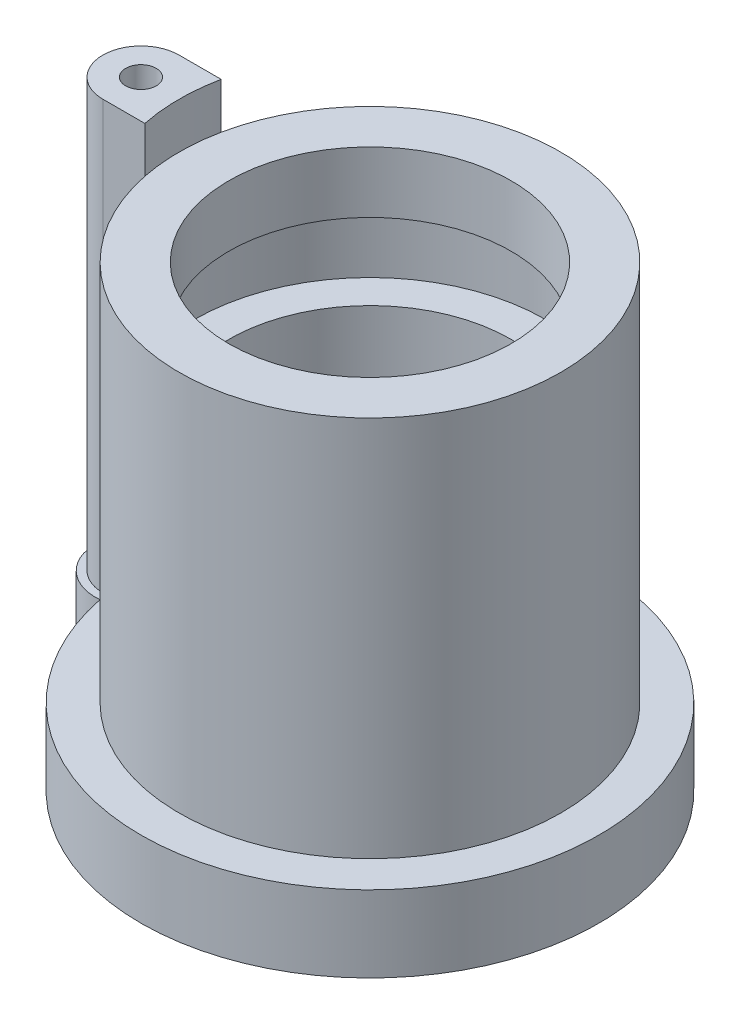
ISO-10303-21;
HEADER;
FILE_DESCRIPTION(('STEP AP214'),'2;1');
FILE_NAME('part.step','',(''),(''),'','','');
FILE_SCHEMA(('AUTOMOTIVE_DESIGN { 1 0 10303 214 1 1 1 1 }'));
ENDSEC;
DATA;
#1=APPLICATION_CONTEXT('core data for automotive mechanical design processes');
#2=APPLICATION_PROTOCOL_DEFINITION('international standard','automotive_design',2000,#1);
#3=PRODUCT_CONTEXT('',#1,'mechanical');
#4=PRODUCT('Part','Part','',(#3));
#5=PRODUCT_RELATED_PRODUCT_CATEGORY('part','',(#4));
#6=PRODUCT_DEFINITION_FORMATION('','',#4);
#7=PRODUCT_DEFINITION_CONTEXT('part definition',#1,'design');
#8=PRODUCT_DEFINITION('design','',#6,#7);
#9=PRODUCT_DEFINITION_SHAPE('','',#8);
#10=(LENGTH_UNIT() NAMED_UNIT(*) SI_UNIT(.MILLI.,.METRE.));
#11=(NAMED_UNIT(*) PLANE_ANGLE_UNIT() SI_UNIT($,.RADIAN.));
#12=(NAMED_UNIT(*) SI_UNIT($,.STERADIAN.) SOLID_ANGLE_UNIT());
#13=UNCERTAINTY_MEASURE_WITH_UNIT(LENGTH_MEASURE(1.E-05),#10,'distance_accuracy_value','');
#14=(GEOMETRIC_REPRESENTATION_CONTEXT(3) GLOBAL_UNCERTAINTY_ASSIGNED_CONTEXT((#13)) GLOBAL_UNIT_ASSIGNED_CONTEXT((#10,
#11,#12)) REPRESENTATION_CONTEXT('',''));
#15=CARTESIAN_POINT('',(0.,0.,0.));
#16=DIRECTION('',(0.,0.,1.));
#17=DIRECTION('',(1.,0.,0.));
#18=AXIS2_PLACEMENT_3D('',#15,#16,#17);
#19=CARTESIAN_POINT('',(0.,0.,0.));
#20=DIRECTION('',(0.,-1.,0.));
#21=DIRECTION('',(0.,0.,-1.));
#22=AXIS2_PLACEMENT_3D('',#19,#20,#21);
#23=PLANE('',#22);
#24=CARTESIAN_POINT('',(-15.,0.,0.));
#25=DIRECTION('',(0.,-1.,0.));
#26=DIRECTION('',(0.,0.,-1.));
#27=AXIS2_PLACEMENT_3D('',#24,#25,#26);
#28=CIRCLE('',#27,3.);
#29=CARTESIAN_POINT('',(-14.7,0.,2.98496231131986));
#30=VERTEX_POINT('',#29);
#31=CARTESIAN_POINT('',(-14.7,0.,-2.98496231131986));
#32=VERTEX_POINT('',#31);
#33=EDGE_CURVE('E93',#30,#32,#28,.T.);
#34=ORIENTED_EDGE('',*,*,#33,.F.);
#35=CARTESIAN_POINT('',(0.,0.,0.));
#36=DIRECTION('',(0.,-1.,0.));
#37=DIRECTION('',(0.,0.,-1.));
#38=AXIS2_PLACEMENT_3D('',#35,#36,#37);
#39=CIRCLE('',#38,15.);
#40=EDGE_CURVE('E81',#32,#30,#39,.T.);
#41=ORIENTED_EDGE('',*,*,#40,.F.);
#42=EDGE_LOOP('',(#34,#41));
#43=FACE_BOUND('',#42,.T.);
#44=CARTESIAN_POINT('',(-15.,0.,0.));
#45=DIRECTION('',(0.,1.,0.));
#46=DIRECTION('',(0.,0.,1.));
#47=AXIS2_PLACEMENT_3D('',#44,#45,#46);
#48=CIRCLE('',#47,2.5);
#49=CARTESIAN_POINT('',(-15.,0.,-2.5));
#50=VERTEX_POINT('',#49);
#51=CARTESIAN_POINT('',(-15.,0.,2.5));
#52=VERTEX_POINT('',#51);
#53=EDGE_CURVE('E61',#50,#52,#48,.T.);
#54=ORIENTED_EDGE('',*,*,#53,.F.);
#55=DIRECTION('',(1.,0.,0.));
#56=VECTOR('',#55,1.);
#57=CARTESIAN_POINT('',(0.,0.,-2.5));
#58=LINE('',#57,#56);
#59=CARTESIAN_POINT('',(-12.2474487139159,0.,-2.5));
#60=VERTEX_POINT('',#59);
#61=EDGE_CURVE('E206',#50,#60,#58,.T.);
#62=ORIENTED_EDGE('',*,*,#61,.T.);
#63=CARTESIAN_POINT('',(0.,0.,0.));
#64=DIRECTION('',(0.,1.,0.));
#65=DIRECTION('',(0.,0.,1.));
#66=AXIS2_PLACEMENT_3D('',#63,#64,#65);
#67=CIRCLE('',#66,12.5);
#68=CARTESIAN_POINT('',(-12.2474487139159,0.,2.49999999999999));
#69=VERTEX_POINT('',#68);
#70=EDGE_CURVE('E48',#69,#60,#67,.T.);
#71=ORIENTED_EDGE('',*,*,#70,.F.);
#72=DIRECTION('',(-1.,0.,0.));
#73=VECTOR('',#72,1.);
#74=CARTESIAN_POINT('',(0.,0.,2.49999999999995));
#75=LINE('',#74,#73);
#76=EDGE_CURVE('E212',#69,#52,#75,.T.);
#77=ORIENTED_EDGE('',*,*,#76,.T.);
#78=EDGE_LOOP('',(#54,#62,#71,#77));
#79=FACE_BOUND('',#78,.T.);
#80=ADVANCED_FACE('F44',(#43,#79),#23,.F.);
#81=CARTESIAN_POINT('',(0.,25.,0.));
#82=DIRECTION('',(0.,-1.,0.));
#83=DIRECTION('',(0.,0.,-1.));
#84=AXIS2_PLACEMENT_3D('',#81,#82,#83);
#85=CYLINDRICAL_SURFACE('',#84,9.25);
#86=CARTESIAN_POINT('',(0.,16.,0.));
#87=DIRECTION('',(0.,1.,0.));
#88=DIRECTION('',(0.,0.,1.));
#89=AXIS2_PLACEMENT_3D('',#86,#87,#88);
#90=CIRCLE('',#89,9.25);
#91=CARTESIAN_POINT('',(0.,16.,9.25));
#92=VERTEX_POINT('',#91);
#93=EDGE_CURVE('E113',#92,#92,#90,.T.);
#94=ORIENTED_EDGE('',*,*,#93,.T.);
#95=EDGE_LOOP('',(#94));
#96=FACE_BOUND('',#95,.T.);
#97=CARTESIAN_POINT('',(0.,-5.,0.));
#98=DIRECTION('',(0.,-1.,0.));
#99=DIRECTION('',(0.,0.,-1.));
#100=AXIS2_PLACEMENT_3D('',#97,#98,#99);
#101=CIRCLE('',#100,9.25);
#102=CARTESIAN_POINT('',(0.,-5.,-9.25));
#103=VERTEX_POINT('',#102);
#104=EDGE_CURVE('E98',#103,#103,#101,.F.);
#105=ORIENTED_EDGE('',*,*,#104,.F.);
#106=EDGE_LOOP('',(#105));
#107=FACE_BOUND('',#106,.T.);
#108=ADVANCED_FACE('F235',(#96,#107),#85,.F.);
#109=CARTESIAN_POINT('',(0.,21.,0.));
#110=DIRECTION('',(0.,1.,0.));
#111=DIRECTION('',(0.,0.,1.));
#112=AXIS2_PLACEMENT_3D('',#109,#110,#111);
#113=CIRCLE('',#112,9.25);
#114=CARTESIAN_POINT('',(0.,21.,9.25));
#115=VERTEX_POINT('',#114);
#116=EDGE_CURVE('E118',#115,#115,#113,.T.);
#117=ORIENTED_EDGE('',*,*,#116,.F.);
#118=EDGE_LOOP('',(#117));
#119=FACE_BOUND('',#118,.T.);
#120=CARTESIAN_POINT('',(0.,25.,0.));
#121=DIRECTION('',(0.,1.,0.));
#122=DIRECTION('',(0.,0.,1.));
#123=AXIS2_PLACEMENT_3D('',#120,#121,#122);
#124=CIRCLE('',#123,9.25);
#125=CARTESIAN_POINT('',(0.,25.,9.25));
#126=VERTEX_POINT('',#125);
#127=EDGE_CURVE('E126',#126,#126,#124,.T.);
#128=ORIENTED_EDGE('',*,*,#127,.T.);
#129=EDGE_LOOP('',(#128));
#130=FACE_BOUND('',#129,.T.);
#131=ADVANCED_FACE('F46',(#119,#130),#85,.F.);
#132=CARTESIAN_POINT('',(0.,25.,0.));
#133=DIRECTION('',(0.,-1.,0.));
#134=DIRECTION('',(0.,0.,-1.));
#135=AXIS2_PLACEMENT_3D('',#132,#133,#134);
#136=CYLINDRICAL_SURFACE('',#135,12.5);
#137=ORIENTED_EDGE('',*,*,#70,.T.);
#138=DIRECTION('',(0.,-1.,0.));
#139=VECTOR('',#138,1.);
#140=CARTESIAN_POINT('',(-12.2474487139159,28.,-2.5));
#141=LINE('',#140,#139);
#142=CARTESIAN_POINT('',(-12.2474487139159,25.,-2.5));
#143=VERTEX_POINT('',#142);
#144=EDGE_CURVE('E106',#143,#60,#141,.T.);
#145=ORIENTED_EDGE('',*,*,#144,.F.);
#146=CARTESIAN_POINT('',(0.,25.,0.));
#147=DIRECTION('',(0.,1.,0.));
#148=DIRECTION('',(0.,0.,1.));
#149=AXIS2_PLACEMENT_3D('',#146,#147,#148);
#150=CIRCLE('',#149,12.5);
#151=CARTESIAN_POINT('',(-12.2474487139159,25.,2.49999999999999));
#152=VERTEX_POINT('',#151);
#153=EDGE_CURVE('E54',#152,#143,#150,.T.);
#154=ORIENTED_EDGE('',*,*,#153,.F.);
#155=DIRECTION('',(0.,-1.,0.));
#156=VECTOR('',#155,1.);
#157=CARTESIAN_POINT('',(-12.2474487139159,28.,2.49999999999999));
#158=LINE('',#157,#156);
#159=EDGE_CURVE('E148',#152,#69,#158,.T.);
#160=ORIENTED_EDGE('',*,*,#159,.T.);
#161=EDGE_LOOP('',(#137,#145,#154,#160));
#162=FACE_BOUND('',#161,.T.);
#163=ADVANCED_FACE('F145',(#162),#136,.T.);
#164=CARTESIAN_POINT('',(0.,25.,0.));
#165=DIRECTION('',(0.,1.,0.));
#166=DIRECTION('',(0.,0.,1.));
#167=AXIS2_PLACEMENT_3D('',#164,#165,#166);
#168=PLANE('',#167);
#169=ORIENTED_EDGE('',*,*,#127,.F.);
#170=EDGE_LOOP('',(#169));
#171=FACE_BOUND('',#170,.T.);
#172=EDGE_CURVE('E11',#143,#152,#150,.T.);
#173=ORIENTED_EDGE('',*,*,#172,.T.);
#174=ORIENTED_EDGE('',*,*,#153,.T.);
#175=EDGE_LOOP('',(#173,#174));
#176=FACE_BOUND('',#175,.T.);
#177=ADVANCED_FACE('F138',(#171,#176),#168,.T.);
#178=CARTESIAN_POINT('',(0.,16.,0.));
#179=DIRECTION('',(0.,1.,0.));
#180=DIRECTION('',(0.,0.,1.));
#181=AXIS2_PLACEMENT_3D('',#178,#179,#180);
#182=CYLINDRICAL_SURFACE('',#181,11.5);
#183=CARTESIAN_POINT('',(0.,16.,0.));
#184=DIRECTION('',(0.,1.,0.));
#185=DIRECTION('',(0.,0.,1.));
#186=AXIS2_PLACEMENT_3D('',#183,#184,#185);
#187=CIRCLE('',#186,11.5);
#188=CARTESIAN_POINT('',(0.,16.,11.5));
#189=VERTEX_POINT('',#188);
#190=EDGE_CURVE('E122',#189,#189,#187,.T.);
#191=ORIENTED_EDGE('',*,*,#190,.F.);
#192=EDGE_LOOP('',(#191));
#193=FACE_BOUND('',#192,.T.);
#194=CARTESIAN_POINT('',(0.,21.,0.));
#195=DIRECTION('',(0.,1.,0.));
#196=DIRECTION('',(0.,0.,1.));
#197=AXIS2_PLACEMENT_3D('',#194,#195,#196);
#198=CIRCLE('',#197,11.5);
#199=CARTESIAN_POINT('',(0.,21.,11.5));
#200=VERTEX_POINT('',#199);
#201=EDGE_CURVE('E117',#200,#200,#198,.T.);
#202=ORIENTED_EDGE('',*,*,#201,.T.);
#203=EDGE_LOOP('',(#202));
#204=FACE_BOUND('',#203,.T.);
#205=ADVANCED_FACE('F253',(#193,#204),#182,.F.);
#206=CARTESIAN_POINT('',(0.,16.,0.));
#207=DIRECTION('',(0.,1.,0.));
#208=DIRECTION('',(0.,0.,1.));
#209=AXIS2_PLACEMENT_3D('',#206,#207,#208);
#210=PLANE('',#209);
#211=ORIENTED_EDGE('',*,*,#93,.F.);
#212=EDGE_LOOP('',(#211));
#213=FACE_BOUND('',#212,.T.);
#214=ORIENTED_EDGE('',*,*,#190,.T.);
#215=EDGE_LOOP('',(#214));
#216=FACE_BOUND('',#215,.T.);
#217=ADVANCED_FACE('F249',(#213,#216),#210,.T.);
#218=CARTESIAN_POINT('',(0.,21.,0.));
#219=DIRECTION('',(0.,1.,0.));
#220=DIRECTION('',(0.,0.,1.));
#221=AXIS2_PLACEMENT_3D('',#218,#219,#220);
#222=PLANE('',#221);
#223=ORIENTED_EDGE('',*,*,#116,.T.);
#224=EDGE_LOOP('',(#223));
#225=FACE_BOUND('',#224,.T.);
#226=ORIENTED_EDGE('',*,*,#201,.F.);
#227=EDGE_LOOP('',(#226));
#228=FACE_BOUND('',#227,.T.);
#229=ADVANCED_FACE('F252',(#225,#228),#222,.F.);
#230=CARTESIAN_POINT('',(-15.,-5.,0.));
#231=DIRECTION('',(0.,1.,0.));
#232=DIRECTION('',(0.,0.,1.));
#233=AXIS2_PLACEMENT_3D('',#230,#231,#232);
#234=CYLINDRICAL_SURFACE('',#233,3.);
#235=ORIENTED_EDGE('',*,*,#33,.T.);
#236=DIRECTION('',(0.,1.,0.));
#237=VECTOR('',#236,1.);
#238=CARTESIAN_POINT('',(-14.7,-5.,-2.98496231131986));
#239=LINE('',#238,#237);
#240=CARTESIAN_POINT('',(-14.7,-5.,-2.98496231131986));
#241=VERTEX_POINT('',#240);
#242=EDGE_CURVE('E87',#241,#32,#239,.T.);
#243=ORIENTED_EDGE('',*,*,#242,.F.);
#244=CARTESIAN_POINT('',(-15.,-5.,0.));
#245=DIRECTION('',(0.,-1.,0.));
#246=DIRECTION('',(0.,0.,-1.));
#247=AXIS2_PLACEMENT_3D('',#244,#245,#246);
#248=CIRCLE('',#247,3.);
#249=CARTESIAN_POINT('',(-14.7,-5.,2.98496231131986));
#250=VERTEX_POINT('',#249);
#251=EDGE_CURVE('E92',#250,#241,#248,.T.);
#252=ORIENTED_EDGE('',*,*,#251,.F.);
#253=DIRECTION('',(0.,1.,0.));
#254=VECTOR('',#253,1.);
#255=CARTESIAN_POINT('',(-14.7,-5.,2.98496231131986));
#256=LINE('',#255,#254);
#257=EDGE_CURVE('E84',#250,#30,#256,.T.);
#258=ORIENTED_EDGE('',*,*,#257,.T.);
#259=EDGE_LOOP('',(#235,#243,#252,#258));
#260=FACE_BOUND('',#259,.T.);
#261=ADVANCED_FACE('F96',(#260),#234,.T.);
#262=CARTESIAN_POINT('',(0.,-5.,0.));
#263=DIRECTION('',(0.,1.,0.));
#264=DIRECTION('',(0.,0.,1.));
#265=AXIS2_PLACEMENT_3D('',#262,#263,#264);
#266=CYLINDRICAL_SURFACE('',#265,15.);
#267=ORIENTED_EDGE('',*,*,#40,.T.);
#268=ORIENTED_EDGE('',*,*,#257,.F.);
#269=CARTESIAN_POINT('',(0.,-5.,0.));
#270=DIRECTION('',(0.,-1.,0.));
#271=DIRECTION('',(0.,0.,-1.));
#272=AXIS2_PLACEMENT_3D('',#269,#270,#271);
#273=CIRCLE('',#272,15.);
#274=EDGE_CURVE('E69',#241,#250,#273,.T.);
#275=ORIENTED_EDGE('',*,*,#274,.F.);
#276=ORIENTED_EDGE('',*,*,#242,.T.);
#277=EDGE_LOOP('',(#267,#268,#275,#276));
#278=FACE_BOUND('',#277,.T.);
#279=ADVANCED_FACE('F83',(#278),#266,.T.);
#280=CARTESIAN_POINT('',(0.,-5.,0.));
#281=DIRECTION('',(0.,-1.,0.));
#282=DIRECTION('',(0.,0.,-1.));
#283=AXIS2_PLACEMENT_3D('',#280,#281,#282);
#284=PLANE('',#283);
#285=ORIENTED_EDGE('',*,*,#251,.T.);
#286=ORIENTED_EDGE('',*,*,#274,.T.);
#287=EDGE_LOOP('',(#285,#286));
#288=FACE_BOUND('',#287,.T.);
#289=ORIENTED_EDGE('',*,*,#104,.T.);
#290=EDGE_LOOP('',(#289));
#291=FACE_BOUND('',#290,.T.);
#292=ADVANCED_FACE('F233',(#288,#291),#284,.T.);
#293=CARTESIAN_POINT('',(0.,28.,0.));
#294=DIRECTION('',(0.,-1.,0.));
#295=DIRECTION('',(0.,0.,-1.));
#296=AXIS2_PLACEMENT_3D('',#293,#294,#295);
#297=CYLINDRICAL_SURFACE('',#296,12.5);
#298=ORIENTED_EDGE('',*,*,#172,.F.);
#299=CARTESIAN_POINT('',(-12.2474487139159,28.,-2.5));
#300=VERTEX_POINT('',#299);
#301=EDGE_CURVE('E102',#300,#143,#141,.T.);
#302=ORIENTED_EDGE('',*,*,#301,.F.);
#303=CARTESIAN_POINT('',(0.,28.,0.));
#304=DIRECTION('',(0.,1.,0.));
#305=DIRECTION('',(0.,0.,1.));
#306=AXIS2_PLACEMENT_3D('',#303,#304,#305);
#307=CIRCLE('',#306,12.5);
#308=CARTESIAN_POINT('',(-12.2474487139159,28.,2.49999999999999));
#309=VERTEX_POINT('',#308);
#310=EDGE_CURVE('E176',#309,#300,#307,.F.);
#311=ORIENTED_EDGE('',*,*,#310,.F.);
#312=EDGE_CURVE('E219',#309,#152,#158,.T.);
#313=ORIENTED_EDGE('',*,*,#312,.T.);
#314=EDGE_LOOP('',(#298,#302,#311,#313));
#315=FACE_BOUND('',#314,.T.);
#316=ADVANCED_FACE('F188',(#315),#297,.F.);
#317=CARTESIAN_POINT('',(0.,28.,-2.5));
#318=DIRECTION('',(0.,0.,-1.));
#319=DIRECTION('',(-1.,0.,0.));
#320=AXIS2_PLACEMENT_3D('',#317,#318,#319);
#321=PLANE('',#320);
#322=ORIENTED_EDGE('',*,*,#61,.F.);
#323=DIRECTION('',(0.,-1.,0.));
#324=VECTOR('',#323,1.);
#325=CARTESIAN_POINT('',(-15.,28.,-2.5));
#326=LINE('',#325,#324);
#327=CARTESIAN_POINT('',(-15.,28.,-2.5));
#328=VERTEX_POINT('',#327);
#329=EDGE_CURVE('E192',#328,#50,#326,.T.);
#330=ORIENTED_EDGE('',*,*,#329,.F.);
#331=DIRECTION('',(1.,0.,0.));
#332=VECTOR('',#331,1.);
#333=CARTESIAN_POINT('',(0.,28.,-2.5));
#334=LINE('',#333,#332);
#335=EDGE_CURVE('E181',#328,#300,#334,.T.);
#336=ORIENTED_EDGE('',*,*,#335,.T.);
#337=ORIENTED_EDGE('',*,*,#301,.T.);
#338=ORIENTED_EDGE('',*,*,#144,.T.);
#339=EDGE_LOOP('',(#322,#330,#336,#337,#338));
#340=FACE_BOUND('',#339,.T.);
#341=ADVANCED_FACE('F191',(#340),#321,.T.);
#342=CARTESIAN_POINT('',(-15.,28.,0.));
#343=DIRECTION('',(0.,-1.,0.));
#344=DIRECTION('',(0.,0.,-1.));
#345=AXIS2_PLACEMENT_3D('',#342,#343,#344);
#346=CYLINDRICAL_SURFACE('',#345,2.5);
#347=ORIENTED_EDGE('',*,*,#53,.T.);
#348=DIRECTION('',(0.,-1.,0.));
#349=VECTOR('',#348,1.);
#350=CARTESIAN_POINT('',(-15.,28.,2.5));
#351=LINE('',#350,#349);
#352=CARTESIAN_POINT('',(-15.,28.,2.5));
#353=VERTEX_POINT('',#352);
#354=EDGE_CURVE('E222',#353,#52,#351,.T.);
#355=ORIENTED_EDGE('',*,*,#354,.F.);
#356=CARTESIAN_POINT('',(-15.,28.,0.));
#357=DIRECTION('',(0.,1.,0.));
#358=DIRECTION('',(0.,0.,1.));
#359=AXIS2_PLACEMENT_3D('',#356,#357,#358);
#360=CIRCLE('',#359,2.5);
#361=EDGE_CURVE('E195',#328,#353,#360,.T.);
#362=ORIENTED_EDGE('',*,*,#361,.F.);
#363=ORIENTED_EDGE('',*,*,#329,.T.);
#364=EDGE_LOOP('',(#347,#355,#362,#363));
#365=FACE_BOUND('',#364,.T.);
#366=ADVANCED_FACE('F298',(#365),#346,.T.);
#367=CARTESIAN_POINT('',(0.,28.,2.49999999999995));
#368=DIRECTION('',(0.,0.,1.));
#369=DIRECTION('',(1.,0.,0.));
#370=AXIS2_PLACEMENT_3D('',#367,#368,#369);
#371=PLANE('',#370);
#372=ORIENTED_EDGE('',*,*,#76,.F.);
#373=ORIENTED_EDGE('',*,*,#159,.F.);
#374=ORIENTED_EDGE('',*,*,#312,.F.);
#375=DIRECTION('',(-1.,0.,0.));
#376=VECTOR('',#375,1.);
#377=CARTESIAN_POINT('',(0.,28.,2.49999999999995));
#378=LINE('',#377,#376);
#379=EDGE_CURVE('E183',#309,#353,#378,.T.);
#380=ORIENTED_EDGE('',*,*,#379,.T.);
#381=ORIENTED_EDGE('',*,*,#354,.T.);
#382=EDGE_LOOP('',(#372,#373,#374,#380,#381));
#383=FACE_BOUND('',#382,.T.);
#384=ADVANCED_FACE('F306',(#383),#371,.T.);
#385=CARTESIAN_POINT('',(-15.,28.,0.));
#386=DIRECTION('',(0.,-1.,0.));
#387=DIRECTION('',(0.,0.,-1.));
#388=AXIS2_PLACEMENT_3D('',#385,#386,#387);
#389=CYLINDRICAL_SURFACE('',#388,1.);
#390=CARTESIAN_POINT('',(-15.,28.,0.));
#391=DIRECTION('',(0.,1.,0.));
#392=DIRECTION('',(0.,0.,1.));
#393=AXIS2_PLACEMENT_3D('',#390,#391,#392);
#394=CIRCLE('',#393,1.);
#395=CARTESIAN_POINT('',(-15.,28.,1.));
#396=VERTEX_POINT('',#395);
#397=EDGE_CURVE('E202',#396,#396,#394,.T.);
#398=ORIENTED_EDGE('',*,*,#397,.T.);
#399=EDGE_LOOP('',(#398));
#400=FACE_BOUND('',#399,.T.);
#401=CARTESIAN_POINT('',(-15.,0.,0.));
#402=DIRECTION('',(0.,1.,0.));
#403=DIRECTION('',(0.,0.,1.));
#404=AXIS2_PLACEMENT_3D('',#401,#402,#403);
#405=CIRCLE('',#404,1.);
#406=CARTESIAN_POINT('',(-15.,0.,1.));
#407=VERTEX_POINT('',#406);
#408=EDGE_CURVE('E186',#407,#407,#405,.T.);
#409=ORIENTED_EDGE('',*,*,#408,.F.);
#410=EDGE_LOOP('',(#409));
#411=FACE_BOUND('',#410,.T.);
#412=ADVANCED_FACE('F314',(#400,#411),#389,.F.);
#413=CARTESIAN_POINT('',(0.,28.,0.));
#414=DIRECTION('',(0.,1.,0.));
#415=DIRECTION('',(0.,0.,1.));
#416=AXIS2_PLACEMENT_3D('',#413,#414,#415);
#417=PLANE('',#416);
#418=ORIENTED_EDGE('',*,*,#310,.T.);
#419=ORIENTED_EDGE('',*,*,#335,.F.);
#420=ORIENTED_EDGE('',*,*,#361,.T.);
#421=ORIENTED_EDGE('',*,*,#379,.F.);
#422=EDGE_LOOP('',(#418,#419,#420,#421));
#423=FACE_BOUND('',#422,.T.);
#424=ORIENTED_EDGE('',*,*,#397,.F.);
#425=EDGE_LOOP('',(#424));
#426=FACE_BOUND('',#425,.T.);
#427=ADVANCED_FACE('F178',(#423,#426),#417,.T.);
#428=ORIENTED_EDGE('',*,*,#408,.T.);
#429=EDGE_LOOP('',(#428));
#430=FACE_BOUND('',#429,.T.);
#431=ADVANCED_FACE('F246',(#430),#23,.F.);
#432=CLOSED_SHELL('',(#80,#108,#131,#163,#177,#205,#217,#229,#261,#279,#292,#316,#341,#366,#384,
#412,#427,#431));
#433=MANIFOLD_SOLID_BREP('B2',#432);
#434=ADVANCED_BREP_SHAPE_REPRESENTATION('',(#18,#433),#14);
#435=SHAPE_DEFINITION_REPRESENTATION(#9,#434);
ENDSEC;
END-ISO-10303-21;
